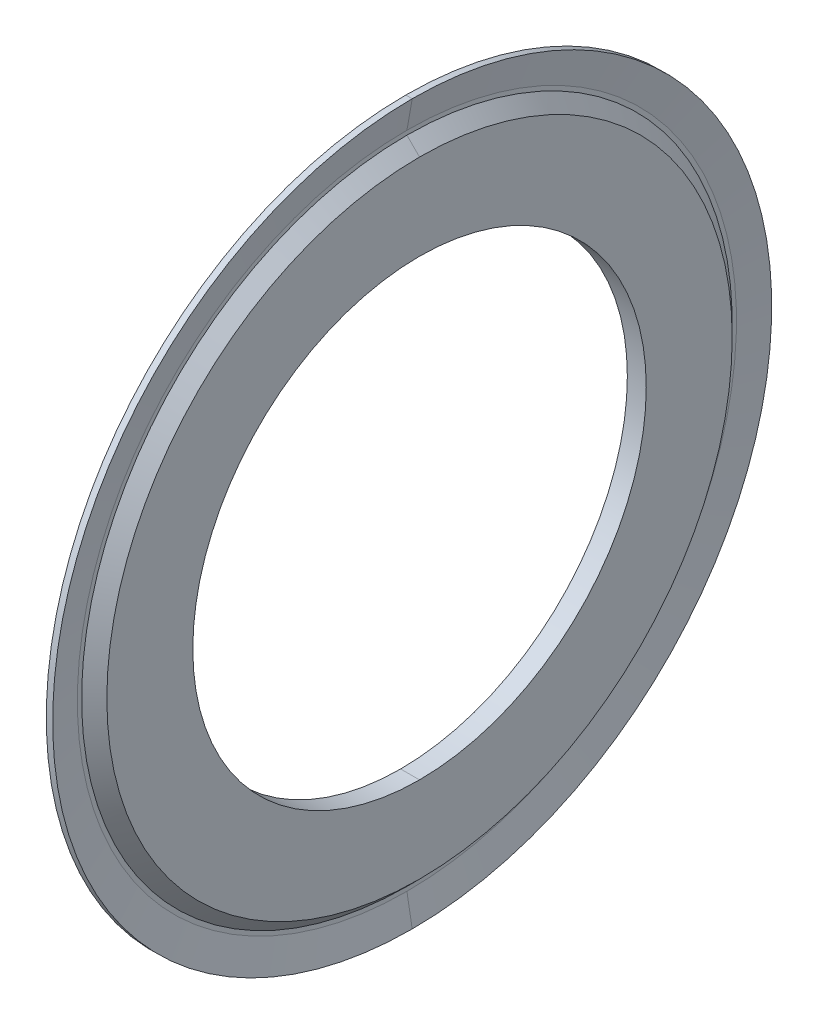
ISO-10303-21;
HEADER;
FILE_DESCRIPTION(('STEP AP214'),'2;1');
FILE_NAME('part.step','',(''),(''),'','','');
FILE_SCHEMA(('AUTOMOTIVE_DESIGN { 1 0 10303 214 1 1 1 1 }'));
ENDSEC;
DATA;
#1=APPLICATION_CONTEXT('core data for automotive mechanical design processes');
#2=APPLICATION_PROTOCOL_DEFINITION('international standard','automotive_design',2000,#1);
#3=PRODUCT_CONTEXT('',#1,'mechanical');
#4=PRODUCT('Part','Part','',(#3));
#5=PRODUCT_RELATED_PRODUCT_CATEGORY('part','',(#4));
#6=PRODUCT_DEFINITION_FORMATION('','',#4);
#7=PRODUCT_DEFINITION_CONTEXT('part definition',#1,'design');
#8=PRODUCT_DEFINITION('design','',#6,#7);
#9=PRODUCT_DEFINITION_SHAPE('','',#8);
#10=(LENGTH_UNIT() NAMED_UNIT(*) SI_UNIT(.MILLI.,.METRE.));
#11=(NAMED_UNIT(*) PLANE_ANGLE_UNIT() SI_UNIT($,.RADIAN.));
#12=(NAMED_UNIT(*) SI_UNIT($,.STERADIAN.) SOLID_ANGLE_UNIT());
#13=UNCERTAINTY_MEASURE_WITH_UNIT(LENGTH_MEASURE(1.E-05),#10,'distance_accuracy_value','');
#14=(GEOMETRIC_REPRESENTATION_CONTEXT(3) GLOBAL_UNCERTAINTY_ASSIGNED_CONTEXT((#13)) GLOBAL_UNIT_ASSIGNED_CONTEXT((#10,
#11,#12)) REPRESENTATION_CONTEXT('',''));
#15=CARTESIAN_POINT('',(0.,0.,0.));
#16=DIRECTION('',(0.,0.,1.));
#17=DIRECTION('',(1.,0.,0.));
#18=AXIS2_PLACEMENT_3D('',#15,#16,#17);
#19=CARTESIAN_POINT('',(4.58922313781657,5.438,0.));
#20=DIRECTION('',(-1.,0.,0.));
#21=DIRECTION('',(0.,1.,0.));
#22=AXIS2_PLACEMENT_3D('',#19,#20,#21);
#23=PLANE('',#22);
#24=CARTESIAN_POINT('',(4.58922313781657,0.,0.));
#25=DIRECTION('',(1.,0.,0.));
#26=DIRECTION('',(0.,1.,0.));
#27=AXIS2_PLACEMENT_3D('',#24,#25,#26);
#28=CIRCLE('',#27,5.376);
#29=CARTESIAN_POINT('',(4.58922313781657,5.376,0.));
#30=VERTEX_POINT('',#29);
#31=CARTESIAN_POINT('',(4.58922313781657,-5.376,0.));
#32=VERTEX_POINT('',#31);
#33=EDGE_CURVE('E11',#30,#32,#28,.T.);
#34=ORIENTED_EDGE('',*,*,#33,.T.);
#35=CARTESIAN_POINT('',(4.58922313781657,0.,0.));
#36=DIRECTION('',(1.,0.,0.));
#37=DIRECTION('',(0.,1.,0.));
#38=AXIS2_PLACEMENT_3D('',#35,#36,#37);
#39=CIRCLE('',#38,5.376);
#40=EDGE_CURVE('E109',#32,#30,#39,.T.);
#41=ORIENTED_EDGE('',*,*,#40,.T.);
#42=EDGE_LOOP('',(#34,#41));
#43=FACE_BOUND('',#42,.T.);
#44=CARTESIAN_POINT('',(4.58922313781657,0.,0.));
#45=DIRECTION('',(1.,0.,0.));
#46=DIRECTION('',(0.,1.,0.));
#47=AXIS2_PLACEMENT_3D('',#44,#45,#46);
#48=CIRCLE('',#47,5.5);
#49=CARTESIAN_POINT('',(4.58922313781657,5.5,0.));
#50=VERTEX_POINT('',#49);
#51=CARTESIAN_POINT('',(4.58922313781657,-5.5,0.));
#52=VERTEX_POINT('',#51);
#53=EDGE_CURVE('E188',#50,#52,#48,.T.);
#54=ORIENTED_EDGE('',*,*,#53,.F.);
#55=CARTESIAN_POINT('',(4.58922313781657,0.,0.));
#56=DIRECTION('',(1.,0.,0.));
#57=DIRECTION('',(0.,1.,0.));
#58=AXIS2_PLACEMENT_3D('',#55,#56,#57);
#59=CIRCLE('',#58,5.5);
#60=EDGE_CURVE('E29',#52,#50,#59,.T.);
#61=ORIENTED_EDGE('',*,*,#60,.F.);
#62=EDGE_LOOP('',(#54,#61));
#63=FACE_BOUND('',#62,.T.);
#64=ADVANCED_FACE('F16',(#43,#63),#23,.T.);
#65=CARTESIAN_POINT('',(4.69422313781657,0.,0.));
#66=DIRECTION('',(-1.,0.,0.));
#67=DIRECTION('',(0.,1.,0.));
#68=AXIS2_PLACEMENT_3D('',#65,#66,#67);
#69=CONICAL_SURFACE('',#68,5.271,0.785398163397447);
#70=DIRECTION('',(0.707106781186548,-0.707106781186547,0.));
#71=VECTOR('',#70,1.);
#72=CARTESIAN_POINT('',(4.69422313781658,5.271,0.));
#73=LINE('',#72,#71);
#74=CARTESIAN_POINT('',(4.79922313781657,5.166,0.));
#75=VERTEX_POINT('',#74);
#76=EDGE_CURVE('E104',#30,#75,#73,.T.);
#77=ORIENTED_EDGE('',*,*,#76,.T.);
#78=CARTESIAN_POINT('',(4.79922313781657,0.,0.));
#79=DIRECTION('',(1.,0.,0.));
#80=DIRECTION('',(0.,1.,0.));
#81=AXIS2_PLACEMENT_3D('',#78,#79,#80);
#82=CIRCLE('',#81,5.166);
#83=CARTESIAN_POINT('',(4.79922313781658,-5.166,0.));
#84=VERTEX_POINT('',#83);
#85=EDGE_CURVE('E23',#75,#84,#82,.T.);
#86=ORIENTED_EDGE('',*,*,#85,.T.);
#87=DIRECTION('',(-0.707106781186548,-0.707106781186547,0.));
#88=VECTOR('',#87,1.);
#89=CARTESIAN_POINT('',(4.69422313781658,-5.271,0.));
#90=LINE('',#89,#88);
#91=EDGE_CURVE('E106',#84,#32,#90,.T.);
#92=ORIENTED_EDGE('',*,*,#91,.T.);
#93=ORIENTED_EDGE('',*,*,#33,.F.);
#94=EDGE_LOOP('',(#77,#86,#92,#93));
#95=FACE_BOUND('',#94,.T.);
#96=ADVANCED_FACE('F102',(#95),#69,.F.);
#97=CARTESIAN_POINT('',(4.79922313781657,4.52425,0.));
#98=DIRECTION('',(-1.,0.,0.));
#99=DIRECTION('',(0.,1.,0.));
#100=AXIS2_PLACEMENT_3D('',#97,#98,#99);
#101=PLANE('',#100);
#102=CARTESIAN_POINT('',(4.79922313781657,0.,0.));
#103=DIRECTION('',(1.,0.,0.));
#104=DIRECTION('',(0.,1.,0.));
#105=AXIS2_PLACEMENT_3D('',#102,#103,#104);
#106=CIRCLE('',#105,3.8825);
#107=CARTESIAN_POINT('',(4.79922313781657,3.8825,0.));
#108=VERTEX_POINT('',#107);
#109=CARTESIAN_POINT('',(4.79922313781658,-3.8825,0.));
#110=VERTEX_POINT('',#109);
#111=EDGE_CURVE('E146',#108,#110,#106,.T.);
#112=ORIENTED_EDGE('',*,*,#111,.T.);
#113=CARTESIAN_POINT('',(4.79922313781657,0.,0.));
#114=DIRECTION('',(1.,0.,0.));
#115=DIRECTION('',(0.,1.,0.));
#116=AXIS2_PLACEMENT_3D('',#113,#114,#115);
#117=CIRCLE('',#116,3.8825);
#118=EDGE_CURVE('E167',#110,#108,#117,.T.);
#119=ORIENTED_EDGE('',*,*,#118,.T.);
#120=EDGE_LOOP('',(#112,#119));
#121=FACE_BOUND('',#120,.T.);
#122=ORIENTED_EDGE('',*,*,#85,.F.);
#123=CARTESIAN_POINT('',(4.79922313781657,0.,0.));
#124=DIRECTION('',(1.,0.,0.));
#125=DIRECTION('',(0.,1.,0.));
#126=AXIS2_PLACEMENT_3D('',#123,#124,#125);
#127=CIRCLE('',#126,5.166);
#128=EDGE_CURVE('E115',#84,#75,#127,.T.);
#129=ORIENTED_EDGE('',*,*,#128,.F.);
#130=EDGE_LOOP('',(#122,#129));
#131=FACE_BOUND('',#130,.T.);
#132=ADVANCED_FACE('F203',(#121,#131),#101,.T.);
#133=CARTESIAN_POINT('',(4.69422313781657,0.,0.));
#134=DIRECTION('',(1.,0.,0.));
#135=DIRECTION('',(0.,1.,0.));
#136=AXIS2_PLACEMENT_3D('',#133,#134,#135);
#137=CYLINDRICAL_SURFACE('',#136,3.8825);
#138=DIRECTION('',(1.,0.,0.));
#139=VECTOR('',#138,1.);
#140=CARTESIAN_POINT('',(4.69422313781658,3.8825,0.));
#141=LINE('',#140,#139);
#142=CARTESIAN_POINT('',(4.58922313781657,3.8825,0.));
#143=VERTEX_POINT('',#142);
#144=EDGE_CURVE('E128',#143,#108,#141,.T.);
#145=ORIENTED_EDGE('',*,*,#144,.T.);
#146=ORIENTED_EDGE('',*,*,#118,.F.);
#147=DIRECTION('',(-1.,0.,0.));
#148=VECTOR('',#147,1.);
#149=CARTESIAN_POINT('',(4.69422313781658,-3.8825,0.));
#150=LINE('',#149,#148);
#151=CARTESIAN_POINT('',(4.58922313781657,-3.8825,0.));
#152=VERTEX_POINT('',#151);
#153=EDGE_CURVE('E138',#110,#152,#150,.T.);
#154=ORIENTED_EDGE('',*,*,#153,.T.);
#155=CARTESIAN_POINT('',(4.58922313781657,0.,0.));
#156=DIRECTION('',(1.,0.,0.));
#157=DIRECTION('',(0.,1.,0.));
#158=AXIS2_PLACEMENT_3D('',#155,#156,#157);
#159=CIRCLE('',#158,3.8825);
#160=EDGE_CURVE('E169',#152,#143,#159,.T.);
#161=ORIENTED_EDGE('',*,*,#160,.T.);
#162=EDGE_LOOP('',(#145,#146,#154,#161));
#163=FACE_BOUND('',#162,.T.);
#164=ADVANCED_FACE('F205',(#163),#137,.T.);
#165=CARTESIAN_POINT('',(4.58922313781657,3.83,0.));
#166=DIRECTION('',(-1.,0.,0.));
#167=DIRECTION('',(0.,0.,1.));
#168=AXIS2_PLACEMENT_3D('',#165,#166,#167);
#169=PLANE('',#168);
#170=CARTESIAN_POINT('',(4.58922313781657,0.,0.));
#171=DIRECTION('',(1.,0.,0.));
#172=DIRECTION('',(0.,1.,0.));
#173=AXIS2_PLACEMENT_3D('',#170,#171,#172);
#174=CIRCLE('',#173,3.7775);
#175=CARTESIAN_POINT('',(4.58922313781657,3.7775,0.));
#176=VERTEX_POINT('',#175);
#177=CARTESIAN_POINT('',(4.58922313781657,-3.7775,0.));
#178=VERTEX_POINT('',#177);
#179=EDGE_CURVE('E131',#176,#178,#174,.T.);
#180=ORIENTED_EDGE('',*,*,#179,.T.);
#181=CARTESIAN_POINT('',(4.58922313781657,0.,0.));
#182=DIRECTION('',(1.,0.,0.));
#183=DIRECTION('',(0.,1.,0.));
#184=AXIS2_PLACEMENT_3D('',#181,#182,#183);
#185=CIRCLE('',#184,3.7775);
#186=EDGE_CURVE('E118',#178,#176,#185,.T.);
#187=ORIENTED_EDGE('',*,*,#186,.T.);
#188=EDGE_LOOP('',(#180,#187));
#189=FACE_BOUND('',#188,.T.);
#190=CARTESIAN_POINT('',(4.58922313781657,0.,0.));
#191=DIRECTION('',(1.,0.,0.));
#192=DIRECTION('',(0.,1.,0.));
#193=AXIS2_PLACEMENT_3D('',#190,#191,#192);
#194=CIRCLE('',#193,3.8825);
#195=EDGE_CURVE('E135',#143,#152,#194,.T.);
#196=ORIENTED_EDGE('',*,*,#195,.F.);
#197=ORIENTED_EDGE('',*,*,#160,.F.);
#198=EDGE_LOOP('',(#196,#197));
#199=FACE_BOUND('',#198,.T.);
#200=ADVANCED_FACE('F213',(#189,#199),#169,.T.);
#201=CARTESIAN_POINT('',(4.74672313781657,0.,0.));
#202=DIRECTION('',(1.,0.,0.));
#203=DIRECTION('',(0.,1.,0.));
#204=AXIS2_PLACEMENT_3D('',#201,#202,#203);
#205=CYLINDRICAL_SURFACE('',#204,3.7775);
#206=DIRECTION('',(1.,0.,0.));
#207=VECTOR('',#206,1.);
#208=CARTESIAN_POINT('',(4.74672313781657,3.7775,0.));
#209=LINE('',#208,#207);
#210=CARTESIAN_POINT('',(4.90422313781657,3.7775,0.));
#211=VERTEX_POINT('',#210);
#212=EDGE_CURVE('E122',#176,#211,#209,.T.);
#213=ORIENTED_EDGE('',*,*,#212,.T.);
#214=CARTESIAN_POINT('',(4.90422313781657,0.,0.));
#215=DIRECTION('',(1.,0.,0.));
#216=DIRECTION('',(0.,1.,0.));
#217=AXIS2_PLACEMENT_3D('',#214,#215,#216);
#218=CIRCLE('',#217,3.7775);
#219=CARTESIAN_POINT('',(4.90422313781657,-3.7775,0.));
#220=VERTEX_POINT('',#219);
#221=EDGE_CURVE('E129',#211,#220,#218,.T.);
#222=ORIENTED_EDGE('',*,*,#221,.T.);
#223=DIRECTION('',(-1.,0.,0.));
#224=VECTOR('',#223,1.);
#225=CARTESIAN_POINT('',(4.74672313781657,-3.7775,0.));
#226=LINE('',#225,#224);
#227=EDGE_CURVE('E121',#220,#178,#226,.T.);
#228=ORIENTED_EDGE('',*,*,#227,.T.);
#229=ORIENTED_EDGE('',*,*,#179,.F.);
#230=EDGE_LOOP('',(#213,#222,#228,#229));
#231=FACE_BOUND('',#230,.T.);
#232=ADVANCED_FACE('F248',(#231),#205,.F.);
#233=CARTESIAN_POINT('',(4.90422313781657,4.49349621202459,0.));
#234=DIRECTION('',(1.,0.,0.));
#235=DIRECTION('',(0.,1.,0.));
#236=AXIS2_PLACEMENT_3D('',#233,#234,#235);
#237=PLANE('',#236);
#238=ORIENTED_EDGE('',*,*,#221,.F.);
#239=CARTESIAN_POINT('',(4.90422313781657,0.,0.));
#240=DIRECTION('',(1.,0.,0.));
#241=DIRECTION('',(0.,1.,0.));
#242=AXIS2_PLACEMENT_3D('',#239,#240,#241);
#243=CIRCLE('',#242,3.7775);
#244=EDGE_CURVE('E126',#220,#211,#243,.T.);
#245=ORIENTED_EDGE('',*,*,#244,.F.);
#246=EDGE_LOOP('',(#238,#245));
#247=FACE_BOUND('',#246,.T.);
#248=CARTESIAN_POINT('',(4.90422313781657,0.,0.));
#249=DIRECTION('',(1.,0.,0.));
#250=DIRECTION('',(0.,1.,0.));
#251=AXIS2_PLACEMENT_3D('',#248,#249,#250);
#252=CIRCLE('',#251,5.20949242404918);
#253=CARTESIAN_POINT('',(4.90422313781657,5.20949242404918,0.));
#254=VERTEX_POINT('',#253);
#255=CARTESIAN_POINT('',(4.90422313781657,-5.20949242404918,0.));
#256=VERTEX_POINT('',#255);
#257=EDGE_CURVE('E149',#254,#256,#252,.T.);
#258=ORIENTED_EDGE('',*,*,#257,.T.);
#259=CARTESIAN_POINT('',(4.90422313781657,0.,0.));
#260=DIRECTION('',(1.,0.,0.));
#261=DIRECTION('',(0.,1.,0.));
#262=AXIS2_PLACEMENT_3D('',#259,#260,#261);
#263=CIRCLE('',#262,5.20949242404918);
#264=EDGE_CURVE('E132',#256,#254,#263,.T.);
#265=ORIENTED_EDGE('',*,*,#264,.T.);
#266=EDGE_LOOP('',(#258,#265));
#267=FACE_BOUND('',#266,.T.);
#268=ADVANCED_FACE('F257',(#247,#267),#237,.T.);
#269=CARTESIAN_POINT('',(4.79922313781657,0.,0.));
#270=DIRECTION('',(-1.,0.,0.));
#271=DIRECTION('',(0.,1.,0.));
#272=AXIS2_PLACEMENT_3D('',#269,#270,#271);
#273=CONICAL_SURFACE('',#272,5.31449242404918,0.785398163397445);
#274=DIRECTION('',(0.70710678118655,-0.707106781186545,0.));
#275=VECTOR('',#274,1.);
#276=CARTESIAN_POINT('',(4.79922313781657,5.31449242404918,0.));
#277=LINE('',#276,#275);
#278=CARTESIAN_POINT('',(4.69422313781657,5.41949242404917,0.));
#279=VERTEX_POINT('',#278);
#280=EDGE_CURVE('E143',#279,#254,#277,.T.);
#281=ORIENTED_EDGE('',*,*,#280,.T.);
#282=ORIENTED_EDGE('',*,*,#264,.F.);
#283=DIRECTION('',(-0.70710678118655,-0.707106781186545,0.));
#284=VECTOR('',#283,1.);
#285=CARTESIAN_POINT('',(4.79922313781657,-5.31449242404918,0.));
#286=LINE('',#285,#284);
#287=CARTESIAN_POINT('',(4.69422313781657,-5.41949242404917,0.));
#288=VERTEX_POINT('',#287);
#289=EDGE_CURVE('E142',#256,#288,#286,.T.);
#290=ORIENTED_EDGE('',*,*,#289,.T.);
#291=CARTESIAN_POINT('',(4.69422313781657,0.,0.));
#292=DIRECTION('',(1.,0.,0.));
#293=DIRECTION('',(0.,1.,0.));
#294=AXIS2_PLACEMENT_3D('',#291,#292,#293);
#295=CIRCLE('',#294,5.41949242404917);
#296=EDGE_CURVE('E198',#288,#279,#295,.T.);
#297=ORIENTED_EDGE('',*,*,#296,.T.);
#298=EDGE_LOOP('',(#281,#282,#290,#297));
#299=FACE_BOUND('',#298,.T.);
#300=ADVANCED_FACE('F267',(#299),#273,.T.);
#301=CARTESIAN_POINT('',(4.69422313781657,5.45515305718948,0.));
#302=DIRECTION('',(1.,0.,0.));
#303=DIRECTION('',(0.,1.,0.));
#304=AXIS2_PLACEMENT_3D('',#301,#302,#303);
#305=PLANE('',#304);
#306=CARTESIAN_POINT('',(4.69422313781657,0.,0.));
#307=DIRECTION('',(1.,0.,0.));
#308=DIRECTION('',(0.,1.,0.));
#309=AXIS2_PLACEMENT_3D('',#306,#307,#308);
#310=CIRCLE('',#309,5.41949242404917);
#311=EDGE_CURVE('E139',#279,#288,#310,.T.);
#312=ORIENTED_EDGE('',*,*,#311,.F.);
#313=ORIENTED_EDGE('',*,*,#296,.F.);
#314=EDGE_LOOP('',(#312,#313));
#315=FACE_BOUND('',#314,.T.);
#316=CARTESIAN_POINT('',(4.69422313781657,0.,0.));
#317=DIRECTION('',(1.,0.,0.));
#318=DIRECTION('',(0.,1.,0.));
#319=AXIS2_PLACEMENT_3D('',#316,#317,#318);
#320=CIRCLE('',#319,5.49081369032978);
#321=CARTESIAN_POINT('',(4.69422313781657,5.49081369032978,0.));
#322=VERTEX_POINT('',#321);
#323=CARTESIAN_POINT('',(4.69422313781658,-5.49081369032978,0.));
#324=VERTEX_POINT('',#323);
#325=EDGE_CURVE('E196',#322,#324,#320,.T.);
#326=ORIENTED_EDGE('',*,*,#325,.T.);
#327=CARTESIAN_POINT('',(4.69422313781657,0.,0.));
#328=DIRECTION('',(1.,0.,0.));
#329=DIRECTION('',(0.,1.,0.));
#330=AXIS2_PLACEMENT_3D('',#327,#328,#329);
#331=CIRCLE('',#330,5.49081369032978);
#332=EDGE_CURVE('E163',#324,#322,#331,.T.);
#333=ORIENTED_EDGE('',*,*,#332,.T.);
#334=EDGE_LOOP('',(#326,#333));
#335=FACE_BOUND('',#334,.T.);
#336=ADVANCED_FACE('F277',(#315,#335),#305,.T.);
#337=CARTESIAN_POINT('',(4.73823314521415,0.,0.));
#338=DIRECTION('',(1.,0.,0.));
#339=DIRECTION('',(0.,1.,0.));
#340=AXIS2_PLACEMENT_3D('',#337,#338,#339);
#341=CONICAL_SURFACE('',#340,5.74040684516489,1.39626340159546);
#342=DIRECTION('',(0.17364817766693,0.984807753012208,0.));
#343=VECTOR('',#342,1.);
#344=CARTESIAN_POINT('',(4.73823314521415,5.74040684516489,0.));
#345=LINE('',#344,#343);
#346=CARTESIAN_POINT('',(4.78224315261173,5.99,0.));
#347=VERTEX_POINT('',#346);
#348=EDGE_CURVE('E160',#322,#347,#345,.T.);
#349=ORIENTED_EDGE('',*,*,#348,.T.);
#350=CARTESIAN_POINT('',(4.78224315261173,0.,0.));
#351=DIRECTION('',(1.,0.,0.));
#352=DIRECTION('',(0.,1.,0.));
#353=AXIS2_PLACEMENT_3D('',#350,#351,#352);
#354=CIRCLE('',#353,5.99);
#355=CARTESIAN_POINT('',(4.78224315261173,-5.99,0.));
#356=VERTEX_POINT('',#355);
#357=EDGE_CURVE('E184',#347,#356,#354,.T.);
#358=ORIENTED_EDGE('',*,*,#357,.T.);
#359=DIRECTION('',(-0.17364817766693,0.984807753012208,0.));
#360=VECTOR('',#359,1.);
#361=CARTESIAN_POINT('',(4.73823314521415,-5.74040684516489,0.));
#362=LINE('',#361,#360);
#363=EDGE_CURVE('E166',#356,#324,#362,.T.);
#364=ORIENTED_EDGE('',*,*,#363,.T.);
#365=ORIENTED_EDGE('',*,*,#325,.F.);
#366=EDGE_LOOP('',(#349,#358,#364,#365));
#367=FACE_BOUND('',#366,.T.);
#368=ADVANCED_FACE('F287',(#367),#341,.F.);
#369=CARTESIAN_POINT('',(4.72893325548772,0.,0.));
#370=DIRECTION('',(1.,0.,0.));
#371=DIRECTION('',(0.,1.,0.));
#372=AXIS2_PLACEMENT_3D('',#369,#370,#371);
#373=CYLINDRICAL_SURFACE('',#372,5.99);
#374=DIRECTION('',(1.,0.,0.));
#375=VECTOR('',#374,1.);
#376=CARTESIAN_POINT('',(4.72893325548772,5.99,0.));
#377=LINE('',#376,#375);
#378=CARTESIAN_POINT('',(4.67562335836372,5.99,0.));
#379=VERTEX_POINT('',#378);
#380=EDGE_CURVE('E175',#379,#347,#377,.T.);
#381=ORIENTED_EDGE('',*,*,#380,.T.);
#382=CARTESIAN_POINT('',(4.78224315261173,0.,0.));
#383=DIRECTION('',(1.,0.,0.));
#384=DIRECTION('',(0.,1.,0.));
#385=AXIS2_PLACEMENT_3D('',#382,#383,#384);
#386=CIRCLE('',#385,5.99);
#387=EDGE_CURVE('E172',#356,#347,#386,.T.);
#388=ORIENTED_EDGE('',*,*,#387,.F.);
#389=DIRECTION('',(-1.,0.,0.));
#390=VECTOR('',#389,1.);
#391=CARTESIAN_POINT('',(4.72893325548772,-5.99,0.));
#392=LINE('',#391,#390);
#393=CARTESIAN_POINT('',(4.67562335836372,-5.99,0.));
#394=VERTEX_POINT('',#393);
#395=EDGE_CURVE('E181',#356,#394,#392,.T.);
#396=ORIENTED_EDGE('',*,*,#395,.T.);
#397=CARTESIAN_POINT('',(4.67562335836372,0.,0.));
#398=DIRECTION('',(1.,0.,0.));
#399=DIRECTION('',(0.,1.,0.));
#400=AXIS2_PLACEMENT_3D('',#397,#398,#399);
#401=CIRCLE('',#400,5.99);
#402=EDGE_CURVE('E193',#394,#379,#401,.T.);
#403=ORIENTED_EDGE('',*,*,#402,.T.);
#404=EDGE_LOOP('',(#381,#388,#396,#403));
#405=FACE_BOUND('',#404,.T.);
#406=ADVANCED_FACE('F297',(#405),#373,.T.);
#407=CARTESIAN_POINT('',(4.63242324809015,0.,0.));
#408=DIRECTION('',(1.,0.,0.));
#409=DIRECTION('',(0.,1.,0.));
#410=AXIS2_PLACEMENT_3D('',#407,#408,#409);
#411=CONICAL_SURFACE('',#410,5.745,1.39626340159546);
#412=DIRECTION('',(0.17364817766693,0.984807753012208,0.));
#413=VECTOR('',#412,1.);
#414=CARTESIAN_POINT('',(4.63242324809015,5.745,0.));
#415=LINE('',#414,#413);
#416=EDGE_CURVE('E186',#50,#379,#415,.T.);
#417=ORIENTED_EDGE('',*,*,#416,.T.);
#418=ORIENTED_EDGE('',*,*,#402,.F.);
#419=DIRECTION('',(-0.17364817766693,0.984807753012208,0.));
#420=VECTOR('',#419,1.);
#421=CARTESIAN_POINT('',(4.63242324809015,-5.745,0.));
#422=LINE('',#421,#420);
#423=EDGE_CURVE('E191',#394,#52,#422,.T.);
#424=ORIENTED_EDGE('',*,*,#423,.T.);
#425=ORIENTED_EDGE('',*,*,#60,.T.);
#426=EDGE_LOOP('',(#417,#418,#424,#425));
#427=FACE_BOUND('',#426,.T.);
#428=ADVANCED_FACE('F307',(#427),#411,.T.);
#429=CARTESIAN_POINT('',(4.63242324809015,0.,0.));
#430=DIRECTION('',(1.,0.,0.));
#431=DIRECTION('',(0.,1.,0.));
#432=AXIS2_PLACEMENT_3D('',#429,#430,#431);
#433=CONICAL_SURFACE('',#432,5.745,1.39626340159546);
#434=ORIENTED_EDGE('',*,*,#416,.F.);
#435=ORIENTED_EDGE('',*,*,#53,.T.);
#436=ORIENTED_EDGE('',*,*,#423,.F.);
#437=CARTESIAN_POINT('',(4.67562335836372,0.,0.));
#438=DIRECTION('',(1.,0.,0.));
#439=DIRECTION('',(0.,1.,0.));
#440=AXIS2_PLACEMENT_3D('',#437,#438,#439);
#441=CIRCLE('',#440,5.99);
#442=EDGE_CURVE('E178',#379,#394,#441,.T.);
#443=ORIENTED_EDGE('',*,*,#442,.F.);
#444=EDGE_LOOP('',(#434,#435,#436,#443));
#445=FACE_BOUND('',#444,.T.);
#446=ADVANCED_FACE('F317',(#445),#433,.T.);
#447=CARTESIAN_POINT('',(4.72893325548772,0.,0.));
#448=DIRECTION('',(1.,0.,0.));
#449=DIRECTION('',(0.,1.,0.));
#450=AXIS2_PLACEMENT_3D('',#447,#448,#449);
#451=CYLINDRICAL_SURFACE('',#450,5.99);
#452=ORIENTED_EDGE('',*,*,#380,.F.);
#453=ORIENTED_EDGE('',*,*,#442,.T.);
#454=ORIENTED_EDGE('',*,*,#395,.F.);
#455=ORIENTED_EDGE('',*,*,#357,.F.);
#456=EDGE_LOOP('',(#452,#453,#454,#455));
#457=FACE_BOUND('',#456,.T.);
#458=ADVANCED_FACE('F326',(#457),#451,.T.);
#459=CARTESIAN_POINT('',(4.73823314521415,0.,0.));
#460=DIRECTION('',(1.,0.,0.));
#461=DIRECTION('',(0.,1.,0.));
#462=AXIS2_PLACEMENT_3D('',#459,#460,#461);
#463=CONICAL_SURFACE('',#462,5.74040684516489,1.39626340159546);
#464=ORIENTED_EDGE('',*,*,#348,.F.);
#465=ORIENTED_EDGE('',*,*,#332,.F.);
#466=ORIENTED_EDGE('',*,*,#363,.F.);
#467=ORIENTED_EDGE('',*,*,#387,.T.);
#468=EDGE_LOOP('',(#464,#465,#466,#467));
#469=FACE_BOUND('',#468,.T.);
#470=ADVANCED_FACE('F336',(#469),#463,.F.);
#471=CARTESIAN_POINT('',(4.79922313781657,0.,0.));
#472=DIRECTION('',(-1.,0.,0.));
#473=DIRECTION('',(0.,1.,0.));
#474=AXIS2_PLACEMENT_3D('',#471,#472,#473);
#475=CONICAL_SURFACE('',#474,5.31449242404918,0.785398163397445);
#476=ORIENTED_EDGE('',*,*,#280,.F.);
#477=ORIENTED_EDGE('',*,*,#311,.T.);
#478=ORIENTED_EDGE('',*,*,#289,.F.);
#479=ORIENTED_EDGE('',*,*,#257,.F.);
#480=EDGE_LOOP('',(#476,#477,#478,#479));
#481=FACE_BOUND('',#480,.T.);
#482=ADVANCED_FACE('F346',(#481),#475,.T.);
#483=CARTESIAN_POINT('',(4.74672313781657,0.,0.));
#484=DIRECTION('',(1.,0.,0.));
#485=DIRECTION('',(0.,1.,0.));
#486=AXIS2_PLACEMENT_3D('',#483,#484,#485);
#487=CYLINDRICAL_SURFACE('',#486,3.7775);
#488=ORIENTED_EDGE('',*,*,#212,.F.);
#489=ORIENTED_EDGE('',*,*,#186,.F.);
#490=ORIENTED_EDGE('',*,*,#227,.F.);
#491=ORIENTED_EDGE('',*,*,#244,.T.);
#492=EDGE_LOOP('',(#488,#489,#490,#491));
#493=FACE_BOUND('',#492,.T.);
#494=ADVANCED_FACE('F356',(#493),#487,.F.);
#495=CARTESIAN_POINT('',(4.69422313781657,0.,0.));
#496=DIRECTION('',(1.,0.,0.));
#497=DIRECTION('',(0.,1.,0.));
#498=AXIS2_PLACEMENT_3D('',#495,#496,#497);
#499=CYLINDRICAL_SURFACE('',#498,3.8825);
#500=ORIENTED_EDGE('',*,*,#144,.F.);
#501=ORIENTED_EDGE('',*,*,#195,.T.);
#502=ORIENTED_EDGE('',*,*,#153,.F.);
#503=ORIENTED_EDGE('',*,*,#111,.F.);
#504=EDGE_LOOP('',(#500,#501,#502,#503));
#505=FACE_BOUND('',#504,.T.);
#506=ADVANCED_FACE('F366',(#505),#499,.T.);
#507=CARTESIAN_POINT('',(4.69422313781657,0.,0.));
#508=DIRECTION('',(-1.,0.,0.));
#509=DIRECTION('',(0.,1.,0.));
#510=AXIS2_PLACEMENT_3D('',#507,#508,#509);
#511=CONICAL_SURFACE('',#510,5.271,0.785398163397447);
#512=ORIENTED_EDGE('',*,*,#76,.F.);
#513=ORIENTED_EDGE('',*,*,#40,.F.);
#514=ORIENTED_EDGE('',*,*,#91,.F.);
#515=ORIENTED_EDGE('',*,*,#128,.T.);
#516=EDGE_LOOP('',(#512,#513,#514,#515));
#517=FACE_BOUND('',#516,.T.);
#518=ADVANCED_FACE('F113',(#517),#511,.F.);
#519=CLOSED_SHELL('',(#64,#96,#132,#164,#200,#232,#268,#300,#336,#368,#406,#428,#446,#458,#470,
#482,#494,#506,#518));
#520=MANIFOLD_SOLID_BREP('B1',#519);
#521=ADVANCED_BREP_SHAPE_REPRESENTATION('',(#18,#520),#14);
#522=SHAPE_DEFINITION_REPRESENTATION(#9,#521);
ENDSEC;
END-ISO-10303-21;
